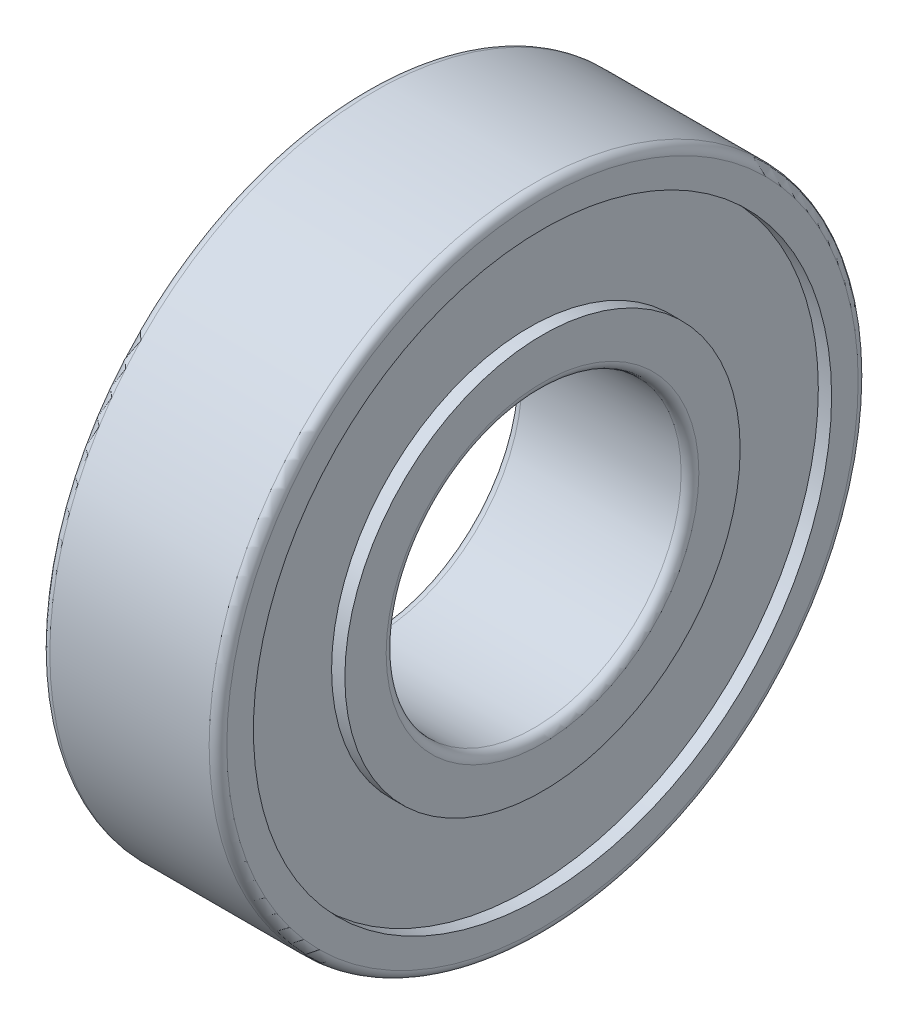
ISO-10303-21;
HEADER;
FILE_DESCRIPTION(('STEP AP214'),'2;1');
FILE_NAME('part.step','',(''),(''),'','','');
FILE_SCHEMA(('AUTOMOTIVE_DESIGN { 1 0 10303 214 1 1 1 1 }'));
ENDSEC;
DATA;
#1=APPLICATION_CONTEXT('core data for automotive mechanical design processes');
#2=APPLICATION_PROTOCOL_DEFINITION('international standard','automotive_design',2000,#1);
#3=PRODUCT_CONTEXT('',#1,'mechanical');
#4=PRODUCT('Part','Part','',(#3));
#5=PRODUCT_RELATED_PRODUCT_CATEGORY('part','',(#4));
#6=PRODUCT_DEFINITION_FORMATION('','',#4);
#7=PRODUCT_DEFINITION_CONTEXT('part definition',#1,'design');
#8=PRODUCT_DEFINITION('design','',#6,#7);
#9=PRODUCT_DEFINITION_SHAPE('','',#8);
#10=(LENGTH_UNIT() NAMED_UNIT(*) SI_UNIT(.MILLI.,.METRE.));
#11=(NAMED_UNIT(*) PLANE_ANGLE_UNIT() SI_UNIT($,.RADIAN.));
#12=(NAMED_UNIT(*) SI_UNIT($,.STERADIAN.) SOLID_ANGLE_UNIT());
#13=UNCERTAINTY_MEASURE_WITH_UNIT(LENGTH_MEASURE(1.E-05),#10,'distance_accuracy_value','');
#14=(GEOMETRIC_REPRESENTATION_CONTEXT(3) GLOBAL_UNCERTAINTY_ASSIGNED_CONTEXT((#13)) GLOBAL_UNIT_ASSIGNED_CONTEXT((#10,
#11,#12)) REPRESENTATION_CONTEXT('',''));
#15=CARTESIAN_POINT('',(0.,0.,0.));
#16=DIRECTION('',(0.,0.,1.));
#17=DIRECTION('',(1.,0.,0.));
#18=AXIS2_PLACEMENT_3D('',#15,#16,#17);
#19=CARTESIAN_POINT('',(0.3,0.,0.));
#20=DIRECTION('',(1.,0.,0.));
#21=DIRECTION('',(0.,0.,-1.));
#22=AXIS2_PLACEMENT_3D('',#19,#20,#21);
#23=TOROIDAL_SURFACE('',#22,5.3,0.3);
#24=CARTESIAN_POINT('',(0.3,0.,0.));
#25=DIRECTION('',(1.,0.,0.));
#26=DIRECTION('',(0.,0.,-1.));
#27=AXIS2_PLACEMENT_3D('',#24,#25,#26);
#28=CIRCLE('',#27,5.);
#29=CARTESIAN_POINT('',(0.3,0.,-5.));
#30=VERTEX_POINT('',#29);
#31=EDGE_CURVE('E10',#30,#30,#28,.T.);
#32=ORIENTED_EDGE('',*,*,#31,.T.);
#33=EDGE_LOOP('',(#32));
#34=FACE_BOUND('',#33,.T.);
#35=CARTESIAN_POINT('',(0.,0.,0.));
#36=DIRECTION('',(1.,0.,0.));
#37=DIRECTION('',(0.,0.,-1.));
#38=AXIS2_PLACEMENT_3D('',#35,#36,#37);
#39=CIRCLE('',#38,5.3);
#40=CARTESIAN_POINT('',(0.,0.,-5.3));
#41=VERTEX_POINT('',#40);
#42=EDGE_CURVE('E85',#41,#41,#39,.T.);
#43=ORIENTED_EDGE('',*,*,#42,.F.);
#44=EDGE_LOOP('',(#43));
#45=FACE_BOUND('',#44,.T.);
#46=ADVANCED_FACE('F33',(#34,#45),#23,.T.);
#47=CARTESIAN_POINT('',(-0.00125399362039863,0.,0.));
#48=DIRECTION('',(1.,0.,0.));
#49=DIRECTION('',(0.,0.,-1.));
#50=AXIS2_PLACEMENT_3D('',#47,#48,#49);
#51=CYLINDRICAL_SURFACE('',#50,5.);
#52=CARTESIAN_POINT('',(5.7,0.,0.));
#53=DIRECTION('',(1.,0.,0.));
#54=DIRECTION('',(0.,0.,-1.));
#55=AXIS2_PLACEMENT_3D('',#52,#53,#54);
#56=CIRCLE('',#55,5.);
#57=CARTESIAN_POINT('',(5.7,0.,-5.));
#58=VERTEX_POINT('',#57);
#59=EDGE_CURVE('E39',#58,#58,#56,.T.);
#60=ORIENTED_EDGE('',*,*,#59,.T.);
#61=EDGE_LOOP('',(#60));
#62=FACE_BOUND('',#61,.T.);
#63=ORIENTED_EDGE('',*,*,#31,.F.);
#64=EDGE_LOOP('',(#63));
#65=FACE_BOUND('',#64,.T.);
#66=ADVANCED_FACE('F93',(#62,#65),#51,.F.);
#67=CARTESIAN_POINT('',(5.7,0.,0.));
#68=DIRECTION('',(1.,0.,0.));
#69=DIRECTION('',(0.,0.,-1.));
#70=AXIS2_PLACEMENT_3D('',#67,#68,#69);
#71=TOROIDAL_SURFACE('',#70,5.3,0.3);
#72=CARTESIAN_POINT('',(6.,0.,0.));
#73=DIRECTION('',(1.,0.,0.));
#74=DIRECTION('',(0.,0.,-1.));
#75=AXIS2_PLACEMENT_3D('',#72,#73,#74);
#76=CIRCLE('',#75,5.3);
#77=CARTESIAN_POINT('',(6.,0.,-5.3));
#78=VERTEX_POINT('',#77);
#79=EDGE_CURVE('E43',#78,#78,#76,.T.);
#80=ORIENTED_EDGE('',*,*,#79,.T.);
#81=EDGE_LOOP('',(#80));
#82=FACE_BOUND('',#81,.T.);
#83=ORIENTED_EDGE('',*,*,#59,.F.);
#84=EDGE_LOOP('',(#83));
#85=FACE_BOUND('',#84,.T.);
#86=ADVANCED_FACE('F97',(#82,#85),#71,.T.);
#87=CARTESIAN_POINT('',(6.,5.3,0.));
#88=DIRECTION('',(1.,0.,0.));
#89=DIRECTION('',(0.,0.,-1.));
#90=AXIS2_PLACEMENT_3D('',#87,#88,#89);
#91=PLANE('',#90);
#92=CARTESIAN_POINT('',(6.,0.,0.));
#93=DIRECTION('',(1.,0.,0.));
#94=DIRECTION('',(0.,0.,-1.));
#95=AXIS2_PLACEMENT_3D('',#92,#93,#94);
#96=CIRCLE('',#95,6.7);
#97=CARTESIAN_POINT('',(6.,0.,-6.7));
#98=VERTEX_POINT('',#97);
#99=EDGE_CURVE('E47',#98,#98,#96,.T.);
#100=ORIENTED_EDGE('',*,*,#99,.T.);
#101=EDGE_LOOP('',(#100));
#102=FACE_BOUND('',#101,.T.);
#103=ORIENTED_EDGE('',*,*,#79,.F.);
#104=EDGE_LOOP('',(#103));
#105=FACE_BOUND('',#104,.T.);
#106=ADVANCED_FACE('F101',(#102,#105),#91,.T.);
#107=CARTESIAN_POINT('',(-0.00125399362039863,0.,0.));
#108=DIRECTION('',(1.,0.,0.));
#109=DIRECTION('',(0.,0.,-1.));
#110=AXIS2_PLACEMENT_3D('',#107,#108,#109);
#111=CYLINDRICAL_SURFACE('',#110,6.7);
#112=CARTESIAN_POINT('',(5.55,0.,0.));
#113=DIRECTION('',(1.,0.,0.));
#114=DIRECTION('',(0.,0.,-1.));
#115=AXIS2_PLACEMENT_3D('',#112,#113,#114);
#116=CIRCLE('',#115,6.7);
#117=CARTESIAN_POINT('',(5.55,0.,-6.7));
#118=VERTEX_POINT('',#117);
#119=EDGE_CURVE('E52',#118,#118,#116,.T.);
#120=ORIENTED_EDGE('',*,*,#119,.T.);
#121=EDGE_LOOP('',(#120));
#122=FACE_BOUND('',#121,.T.);
#123=ORIENTED_EDGE('',*,*,#99,.F.);
#124=EDGE_LOOP('',(#123));
#125=FACE_BOUND('',#124,.T.);
#126=ADVANCED_FACE('F108',(#122,#125),#111,.T.);
#127=CARTESIAN_POINT('',(5.55,6.7,0.));
#128=DIRECTION('',(1.,0.,0.));
#129=DIRECTION('',(0.,0.,-1.));
#130=AXIS2_PLACEMENT_3D('',#127,#128,#129);
#131=PLANE('',#130);
#132=CARTESIAN_POINT('',(5.55,0.,0.));
#133=DIRECTION('',(1.,0.,0.));
#134=DIRECTION('',(0.,0.,-1.));
#135=AXIS2_PLACEMENT_3D('',#132,#133,#134);
#136=CIRCLE('',#135,9.8);
#137=CARTESIAN_POINT('',(5.55,0.,-9.8));
#138=VERTEX_POINT('',#137);
#139=EDGE_CURVE('E55',#138,#138,#136,.T.);
#140=ORIENTED_EDGE('',*,*,#139,.T.);
#141=EDGE_LOOP('',(#140));
#142=FACE_BOUND('',#141,.T.);
#143=ORIENTED_EDGE('',*,*,#119,.F.);
#144=EDGE_LOOP('',(#143));
#145=FACE_BOUND('',#144,.T.);
#146=ADVANCED_FACE('F112',(#142,#145),#131,.T.);
#147=CARTESIAN_POINT('',(-0.00125399362039863,0.,0.));
#148=DIRECTION('',(1.,0.,0.));
#149=DIRECTION('',(0.,0.,-1.));
#150=AXIS2_PLACEMENT_3D('',#147,#148,#149);
#151=CYLINDRICAL_SURFACE('',#150,9.8);
#152=CARTESIAN_POINT('',(6.,0.,0.));
#153=DIRECTION('',(1.,0.,0.));
#154=DIRECTION('',(0.,0.,-1.));
#155=AXIS2_PLACEMENT_3D('',#152,#153,#154);
#156=CIRCLE('',#155,9.8);
#157=CARTESIAN_POINT('',(6.,0.,-9.8));
#158=VERTEX_POINT('',#157);
#159=EDGE_CURVE('E58',#158,#158,#156,.T.);
#160=ORIENTED_EDGE('',*,*,#159,.T.);
#161=EDGE_LOOP('',(#160));
#162=FACE_BOUND('',#161,.T.);
#163=ORIENTED_EDGE('',*,*,#139,.F.);
#164=EDGE_LOOP('',(#163));
#165=FACE_BOUND('',#164,.T.);
#166=ADVANCED_FACE('F116',(#162,#165),#151,.F.);
#167=CARTESIAN_POINT('',(6.,9.8,0.));
#168=DIRECTION('',(1.,0.,0.));
#169=DIRECTION('',(0.,0.,-1.));
#170=AXIS2_PLACEMENT_3D('',#167,#168,#169);
#171=PLANE('',#170);
#172=CARTESIAN_POINT('',(6.,0.,0.));
#173=DIRECTION('',(1.,0.,0.));
#174=DIRECTION('',(0.,0.,-1.));
#175=AXIS2_PLACEMENT_3D('',#172,#173,#174);
#176=CIRCLE('',#175,10.7);
#177=CARTESIAN_POINT('',(6.,0.,-10.7));
#178=VERTEX_POINT('',#177);
#179=EDGE_CURVE('E61',#178,#178,#176,.T.);
#180=ORIENTED_EDGE('',*,*,#179,.T.);
#181=EDGE_LOOP('',(#180));
#182=FACE_BOUND('',#181,.T.);
#183=ORIENTED_EDGE('',*,*,#159,.F.);
#184=EDGE_LOOP('',(#183));
#185=FACE_BOUND('',#184,.T.);
#186=ADVANCED_FACE('F120',(#182,#185),#171,.T.);
#187=CARTESIAN_POINT('',(5.7,0.,0.));
#188=DIRECTION('',(1.,0.,0.));
#189=DIRECTION('',(0.,0.,-1.));
#190=AXIS2_PLACEMENT_3D('',#187,#188,#189);
#191=TOROIDAL_SURFACE('',#190,10.7,0.3);
#192=CARTESIAN_POINT('',(5.7,0.,0.));
#193=DIRECTION('',(1.,0.,0.));
#194=DIRECTION('',(0.,0.,-1.));
#195=AXIS2_PLACEMENT_3D('',#192,#193,#194);
#196=CIRCLE('',#195,11.);
#197=CARTESIAN_POINT('',(5.7,0.,-11.));
#198=VERTEX_POINT('',#197);
#199=EDGE_CURVE('E64',#198,#198,#196,.T.);
#200=ORIENTED_EDGE('',*,*,#199,.T.);
#201=EDGE_LOOP('',(#200));
#202=FACE_BOUND('',#201,.T.);
#203=ORIENTED_EDGE('',*,*,#179,.F.);
#204=EDGE_LOOP('',(#203));
#205=FACE_BOUND('',#204,.T.);
#206=ADVANCED_FACE('F124',(#202,#205),#191,.T.);
#207=CARTESIAN_POINT('',(-0.00125399362039863,0.,0.));
#208=DIRECTION('',(1.,0.,0.));
#209=DIRECTION('',(0.,0.,-1.));
#210=AXIS2_PLACEMENT_3D('',#207,#208,#209);
#211=CYLINDRICAL_SURFACE('',#210,11.);
#212=CARTESIAN_POINT('',(0.3,0.,0.));
#213=DIRECTION('',(1.,0.,0.));
#214=DIRECTION('',(0.,0.,-1.));
#215=AXIS2_PLACEMENT_3D('',#212,#213,#214);
#216=CIRCLE('',#215,11.);
#217=CARTESIAN_POINT('',(0.3,0.,-11.));
#218=VERTEX_POINT('',#217);
#219=EDGE_CURVE('E67',#218,#218,#216,.T.);
#220=ORIENTED_EDGE('',*,*,#219,.T.);
#221=EDGE_LOOP('',(#220));
#222=FACE_BOUND('',#221,.T.);
#223=ORIENTED_EDGE('',*,*,#199,.F.);
#224=EDGE_LOOP('',(#223));
#225=FACE_BOUND('',#224,.T.);
#226=ADVANCED_FACE('F128',(#222,#225),#211,.T.);
#227=CARTESIAN_POINT('',(0.300000000000002,0.,0.));
#228=DIRECTION('',(1.,0.,0.));
#229=DIRECTION('',(0.,0.,-1.));
#230=AXIS2_PLACEMENT_3D('',#227,#228,#229);
#231=TOROIDAL_SURFACE('',#230,10.7,0.300000000000001);
#232=CARTESIAN_POINT('',(0.,0.,0.));
#233=DIRECTION('',(1.,0.,0.));
#234=DIRECTION('',(0.,0.,-1.));
#235=AXIS2_PLACEMENT_3D('',#232,#233,#234);
#236=CIRCLE('',#235,10.7);
#237=CARTESIAN_POINT('',(0.,0.,-10.7));
#238=VERTEX_POINT('',#237);
#239=EDGE_CURVE('E70',#238,#238,#236,.T.);
#240=ORIENTED_EDGE('',*,*,#239,.T.);
#241=EDGE_LOOP('',(#240));
#242=FACE_BOUND('',#241,.T.);
#243=ORIENTED_EDGE('',*,*,#219,.F.);
#244=EDGE_LOOP('',(#243));
#245=FACE_BOUND('',#244,.T.);
#246=ADVANCED_FACE('F132',(#242,#245),#231,.T.);
#247=CARTESIAN_POINT('',(0.,10.7,0.));
#248=DIRECTION('',(-1.,0.,0.));
#249=DIRECTION('',(0.,0.,1.));
#250=AXIS2_PLACEMENT_3D('',#247,#248,#249);
#251=PLANE('',#250);
#252=CARTESIAN_POINT('',(0.,0.,0.));
#253=DIRECTION('',(1.,0.,0.));
#254=DIRECTION('',(0.,0.,-1.));
#255=AXIS2_PLACEMENT_3D('',#252,#253,#254);
#256=CIRCLE('',#255,9.8);
#257=CARTESIAN_POINT('',(0.,0.,-9.8));
#258=VERTEX_POINT('',#257);
#259=EDGE_CURVE('E73',#258,#258,#256,.T.);
#260=ORIENTED_EDGE('',*,*,#259,.T.);
#261=EDGE_LOOP('',(#260));
#262=FACE_BOUND('',#261,.T.);
#263=ORIENTED_EDGE('',*,*,#239,.F.);
#264=EDGE_LOOP('',(#263));
#265=FACE_BOUND('',#264,.T.);
#266=ADVANCED_FACE('F136',(#262,#265),#251,.T.);
#267=CARTESIAN_POINT('',(-0.00125399362039863,0.,0.));
#268=DIRECTION('',(1.,0.,0.));
#269=DIRECTION('',(0.,0.,-1.));
#270=AXIS2_PLACEMENT_3D('',#267,#268,#269);
#271=CYLINDRICAL_SURFACE('',#270,9.8);
#272=CARTESIAN_POINT('',(0.45,0.,0.));
#273=DIRECTION('',(1.,0.,0.));
#274=DIRECTION('',(0.,0.,-1.));
#275=AXIS2_PLACEMENT_3D('',#272,#273,#274);
#276=CIRCLE('',#275,9.8);
#277=CARTESIAN_POINT('',(0.45,0.,-9.8));
#278=VERTEX_POINT('',#277);
#279=EDGE_CURVE('E76',#278,#278,#276,.T.);
#280=ORIENTED_EDGE('',*,*,#279,.T.);
#281=EDGE_LOOP('',(#280));
#282=FACE_BOUND('',#281,.T.);
#283=ORIENTED_EDGE('',*,*,#259,.F.);
#284=EDGE_LOOP('',(#283));
#285=FACE_BOUND('',#284,.T.);
#286=ADVANCED_FACE('F140',(#282,#285),#271,.F.);
#287=CARTESIAN_POINT('',(0.45,9.8,0.));
#288=DIRECTION('',(-1.,0.,0.));
#289=DIRECTION('',(0.,0.,1.));
#290=AXIS2_PLACEMENT_3D('',#287,#288,#289);
#291=PLANE('',#290);
#292=CARTESIAN_POINT('',(0.45,0.,0.));
#293=DIRECTION('',(1.,0.,0.));
#294=DIRECTION('',(0.,0.,-1.));
#295=AXIS2_PLACEMENT_3D('',#292,#293,#294);
#296=CIRCLE('',#295,6.7);
#297=CARTESIAN_POINT('',(0.45,0.,-6.7));
#298=VERTEX_POINT('',#297);
#299=EDGE_CURVE('E79',#298,#298,#296,.T.);
#300=ORIENTED_EDGE('',*,*,#299,.T.);
#301=EDGE_LOOP('',(#300));
#302=FACE_BOUND('',#301,.T.);
#303=ORIENTED_EDGE('',*,*,#279,.F.);
#304=EDGE_LOOP('',(#303));
#305=FACE_BOUND('',#304,.T.);
#306=ADVANCED_FACE('F144',(#302,#305),#291,.T.);
#307=CARTESIAN_POINT('',(-0.00125399362039863,0.,0.));
#308=DIRECTION('',(1.,0.,0.));
#309=DIRECTION('',(0.,0.,-1.));
#310=AXIS2_PLACEMENT_3D('',#307,#308,#309);
#311=CYLINDRICAL_SURFACE('',#310,6.7);
#312=CARTESIAN_POINT('',(0.,0.,0.));
#313=DIRECTION('',(1.,0.,0.));
#314=DIRECTION('',(0.,0.,-1.));
#315=AXIS2_PLACEMENT_3D('',#312,#313,#314);
#316=CIRCLE('',#315,6.7);
#317=CARTESIAN_POINT('',(0.,0.,-6.7));
#318=VERTEX_POINT('',#317);
#319=EDGE_CURVE('E82',#318,#318,#316,.T.);
#320=ORIENTED_EDGE('',*,*,#319,.T.);
#321=EDGE_LOOP('',(#320));
#322=FACE_BOUND('',#321,.T.);
#323=ORIENTED_EDGE('',*,*,#299,.F.);
#324=EDGE_LOOP('',(#323));
#325=FACE_BOUND('',#324,.T.);
#326=ADVANCED_FACE('F148',(#322,#325),#311,.T.);
#327=CARTESIAN_POINT('',(0.,6.7,0.));
#328=DIRECTION('',(-1.,0.,0.));
#329=DIRECTION('',(0.,0.,1.));
#330=AXIS2_PLACEMENT_3D('',#327,#328,#329);
#331=PLANE('',#330);
#332=ORIENTED_EDGE('',*,*,#42,.T.);
#333=EDGE_LOOP('',(#332));
#334=FACE_BOUND('',#333,.T.);
#335=ORIENTED_EDGE('',*,*,#319,.F.);
#336=EDGE_LOOP('',(#335));
#337=FACE_BOUND('',#336,.T.);
#338=ADVANCED_FACE('F89',(#334,#337),#331,.T.);
#339=CLOSED_SHELL('',(#46,#66,#86,#106,#126,#146,#166,#186,#206,#226,#246,#266,#286,#306,#326,#338));
#340=MANIFOLD_SOLID_BREP('B2',#339);
#341=ADVANCED_BREP_SHAPE_REPRESENTATION('',(#18,#340),#14);
#342=SHAPE_DEFINITION_REPRESENTATION(#9,#341);
ENDSEC;
END-ISO-10303-21;
